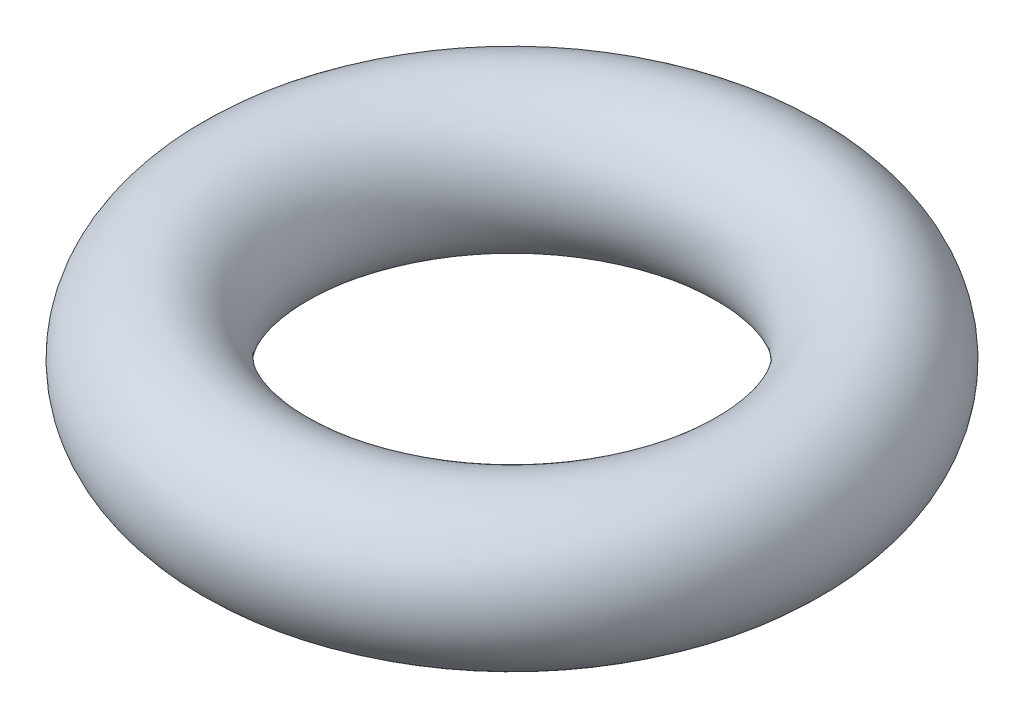
ISO-10303-21;
HEADER;
FILE_DESCRIPTION(('STEP AP214'),'2;1');
FILE_NAME('part.step','',(''),(''),'','','');
FILE_SCHEMA(('AUTOMOTIVE_DESIGN { 1 0 10303 214 1 1 1 1 }'));
ENDSEC;
DATA;
#1=APPLICATION_CONTEXT('core data for automotive mechanical design processes');
#2=APPLICATION_PROTOCOL_DEFINITION('international standard','automotive_design',2000,#1);
#3=PRODUCT_CONTEXT('',#1,'mechanical');
#4=PRODUCT('Part','Part','',(#3));
#5=PRODUCT_RELATED_PRODUCT_CATEGORY('part','',(#4));
#6=PRODUCT_DEFINITION_FORMATION('','',#4);
#7=PRODUCT_DEFINITION_CONTEXT('part definition',#1,'design');
#8=PRODUCT_DEFINITION('design','',#6,#7);
#9=PRODUCT_DEFINITION_SHAPE('','',#8);
#10=(LENGTH_UNIT() NAMED_UNIT(*) SI_UNIT(.MILLI.,.METRE.));
#11=(NAMED_UNIT(*) PLANE_ANGLE_UNIT() SI_UNIT($,.RADIAN.));
#12=(NAMED_UNIT(*) SI_UNIT($,.STERADIAN.) SOLID_ANGLE_UNIT());
#13=UNCERTAINTY_MEASURE_WITH_UNIT(LENGTH_MEASURE(1.E-05),#10,'distance_accuracy_value','');
#14=(GEOMETRIC_REPRESENTATION_CONTEXT(3) GLOBAL_UNCERTAINTY_ASSIGNED_CONTEXT((#13)) GLOBAL_UNIT_ASSIGNED_CONTEXT((#10,
#11,#12)) REPRESENTATION_CONTEXT('',''));
#15=CARTESIAN_POINT('',(0.,0.,0.));
#16=DIRECTION('',(0.,0.,1.));
#17=DIRECTION('',(1.,0.,0.));
#18=AXIS2_PLACEMENT_3D('',#15,#16,#17);
#19=CARTESIAN_POINT('',(0.,0.,0.));
#20=DIRECTION('',(0.,-1.,0.));
#21=DIRECTION('',(0.,0.,-1.));
#22=AXIS2_PLACEMENT_3D('',#19,#20,#21);
#23=TOROIDAL_SURFACE('',#22,3.5,0.999999999999999);
#24=CARTESIAN_POINT('',(0.,0.,-4.5));
#25=VERTEX_POINT('',#24);
#26=VERTEX_LOOP('',#25);
#27=FACE_BOUND('',#26,.T.);
#28=ADVANCED_FACE('F29',(#27),#23,.T.);
#29=CLOSED_SHELL('',(#28));
#30=MANIFOLD_SOLID_BREP('B2',#29);
#31=ADVANCED_BREP_SHAPE_REPRESENTATION('',(#18,#30),#14);
#32=SHAPE_DEFINITION_REPRESENTATION(#9,#31);
ENDSEC;
END-ISO-10303-21;
